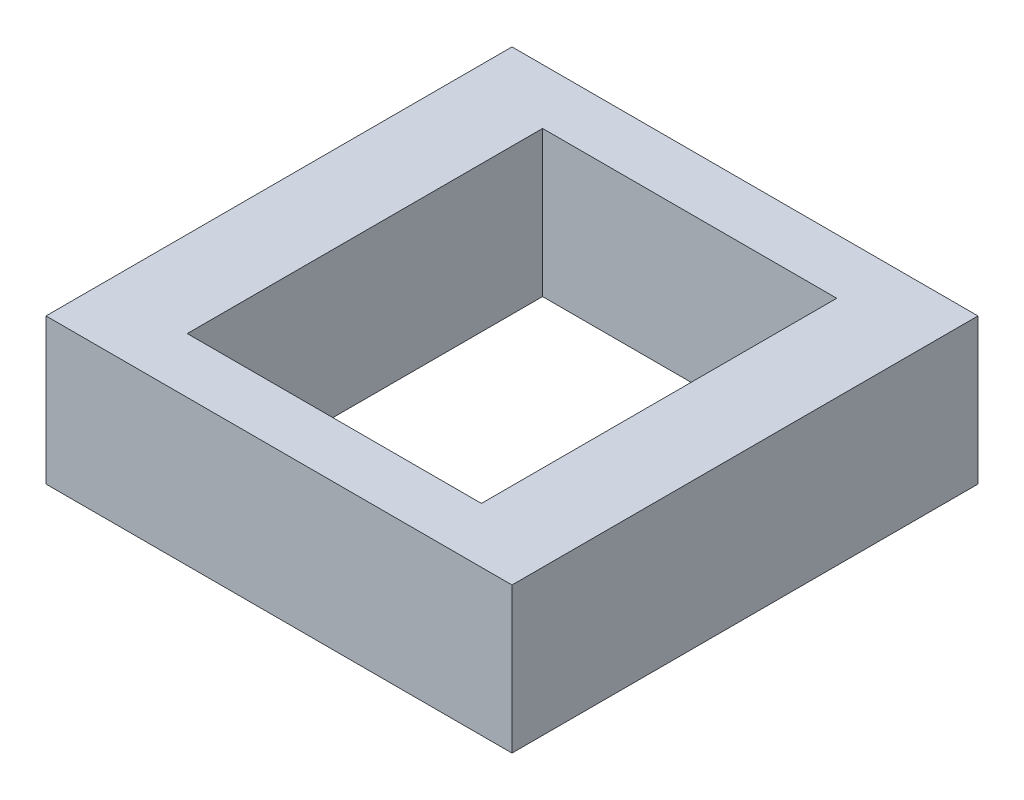
ISO-10303-21;
HEADER;
FILE_DESCRIPTION(('STEP AP214'),'2;1');
FILE_NAME('part.step','',(''),(''),'','','');
FILE_SCHEMA(('AUTOMOTIVE_DESIGN { 1 0 10303 214 1 1 1 1 }'));
ENDSEC;
DATA;
#1=APPLICATION_CONTEXT('core data for automotive mechanical design processes');
#2=APPLICATION_PROTOCOL_DEFINITION('international standard','automotive_design',2000,#1);
#3=PRODUCT_CONTEXT('',#1,'mechanical');
#4=PRODUCT('Part','Part','',(#3));
#5=PRODUCT_RELATED_PRODUCT_CATEGORY('part','',(#4));
#6=PRODUCT_DEFINITION_FORMATION('','',#4);
#7=PRODUCT_DEFINITION_CONTEXT('part definition',#1,'design');
#8=PRODUCT_DEFINITION('design','',#6,#7);
#9=PRODUCT_DEFINITION_SHAPE('','',#8);
#10=(LENGTH_UNIT() NAMED_UNIT(*) SI_UNIT(.MILLI.,.METRE.));
#11=(NAMED_UNIT(*) PLANE_ANGLE_UNIT() SI_UNIT($,.RADIAN.));
#12=(NAMED_UNIT(*) SI_UNIT($,.STERADIAN.) SOLID_ANGLE_UNIT());
#13=UNCERTAINTY_MEASURE_WITH_UNIT(LENGTH_MEASURE(1.E-05),#10,'distance_accuracy_value','');
#14=(GEOMETRIC_REPRESENTATION_CONTEXT(3) GLOBAL_UNCERTAINTY_ASSIGNED_CONTEXT((#13)) GLOBAL_UNIT_ASSIGNED_CONTEXT((#10,
#11,#12)) REPRESENTATION_CONTEXT('',''));
#15=CARTESIAN_POINT('',(0.,0.,0.));
#16=DIRECTION('',(0.,0.,1.));
#17=DIRECTION('',(1.,0.,0.));
#18=AXIS2_PLACEMENT_3D('',#15,#16,#17);
#19=CARTESIAN_POINT('',(0.,5.,0.));
#20=DIRECTION('',(0.,-1.,0.));
#21=DIRECTION('',(0.,0.,-1.));
#22=AXIS2_PLACEMENT_3D('',#19,#20,#21);
#23=PLANE('',#22);
#24=DIRECTION('',(0.,0.,-1.));
#25=VECTOR('',#24,1.);
#26=CARTESIAN_POINT('',(8.,5.,8.));
#27=LINE('',#26,#25);
#28=CARTESIAN_POINT('',(8.,5.,8.));
#29=VERTEX_POINT('',#28);
#30=CARTESIAN_POINT('',(8.,5.,-8.));
#31=VERTEX_POINT('',#30);
#32=EDGE_CURVE('E138',#29,#31,#27,.T.);
#33=ORIENTED_EDGE('',*,*,#32,.T.);
#34=DIRECTION('',(-1.,0.,0.));
#35=VECTOR('',#34,1.);
#36=CARTESIAN_POINT('',(-8.,5.,-8.));
#37=LINE('',#36,#35);
#38=CARTESIAN_POINT('',(-8.,5.,-8.));
#39=VERTEX_POINT('',#38);
#40=EDGE_CURVE('E141',#31,#39,#37,.T.);
#41=ORIENTED_EDGE('',*,*,#40,.T.);
#42=DIRECTION('',(0.,0.,1.));
#43=VECTOR('',#42,1.);
#44=CARTESIAN_POINT('',(-8.,5.,8.));
#45=LINE('',#44,#43);
#46=CARTESIAN_POINT('',(-8.,5.,8.));
#47=VERTEX_POINT('',#46);
#48=EDGE_CURVE('E144',#39,#47,#45,.T.);
#49=ORIENTED_EDGE('',*,*,#48,.T.);
#50=DIRECTION('',(1.,0.,0.));
#51=VECTOR('',#50,1.);
#52=CARTESIAN_POINT('',(-8.,5.,8.));
#53=LINE('',#52,#51);
#54=EDGE_CURVE('E146',#47,#29,#53,.T.);
#55=ORIENTED_EDGE('',*,*,#54,.T.);
#56=EDGE_LOOP('',(#33,#41,#49,#55));
#57=FACE_BOUND('',#56,.T.);
#58=DIRECTION('',(0.,0.,-1.));
#59=VECTOR('',#58,1.);
#60=CARTESIAN_POINT('',(5.05,5.,6.1));
#61=LINE('',#60,#59);
#62=CARTESIAN_POINT('',(5.05,5.,6.1));
#63=VERTEX_POINT('',#62);
#64=CARTESIAN_POINT('',(5.05,5.,-6.1));
#65=VERTEX_POINT('',#64);
#66=EDGE_CURVE('E102',#63,#65,#61,.T.);
#67=ORIENTED_EDGE('',*,*,#66,.F.);
#68=DIRECTION('',(1.,0.,0.));
#69=VECTOR('',#68,1.);
#70=CARTESIAN_POINT('',(-5.05,5.,6.1));
#71=LINE('',#70,#69);
#72=CARTESIAN_POINT('',(-5.05,5.,6.1));
#73=VERTEX_POINT('',#72);
#74=EDGE_CURVE('E124',#73,#63,#71,.T.);
#75=ORIENTED_EDGE('',*,*,#74,.F.);
#76=DIRECTION('',(0.,0.,1.));
#77=VECTOR('',#76,1.);
#78=CARTESIAN_POINT('',(-5.05,5.,6.1));
#79=LINE('',#78,#77);
#80=CARTESIAN_POINT('',(-5.05,5.,-6.1));
#81=VERTEX_POINT('',#80);
#82=EDGE_CURVE('E122',#81,#73,#79,.T.);
#83=ORIENTED_EDGE('',*,*,#82,.F.);
#84=DIRECTION('',(-1.,0.,0.));
#85=VECTOR('',#84,1.);
#86=CARTESIAN_POINT('',(-5.05,5.,-6.1));
#87=LINE('',#86,#85);
#88=EDGE_CURVE('E110',#65,#81,#87,.T.);
#89=ORIENTED_EDGE('',*,*,#88,.F.);
#90=EDGE_LOOP('',(#67,#75,#83,#89));
#91=FACE_BOUND('',#90,.T.);
#92=ADVANCED_FACE('F37',(#57,#91),#23,.F.);
#93=CARTESIAN_POINT('',(0.,0.,0.));
#94=DIRECTION('',(0.,-1.,0.));
#95=DIRECTION('',(0.,0.,-1.));
#96=AXIS2_PLACEMENT_3D('',#93,#94,#95);
#97=PLANE('',#96);
#98=DIRECTION('',(0.,0.,-1.));
#99=VECTOR('',#98,1.);
#100=CARTESIAN_POINT('',(8.,0.,8.));
#101=LINE('',#100,#99);
#102=CARTESIAN_POINT('',(8.,0.,8.));
#103=VERTEX_POINT('',#102);
#104=CARTESIAN_POINT('',(8.,0.,-8.));
#105=VERTEX_POINT('',#104);
#106=EDGE_CURVE('E118',#103,#105,#101,.T.);
#107=ORIENTED_EDGE('',*,*,#106,.F.);
#108=DIRECTION('',(1.,0.,0.));
#109=VECTOR('',#108,1.);
#110=CARTESIAN_POINT('',(-8.,0.,8.));
#111=LINE('',#110,#109);
#112=CARTESIAN_POINT('',(-8.,0.,8.));
#113=VERTEX_POINT('',#112);
#114=EDGE_CURVE('E142',#113,#103,#111,.T.);
#115=ORIENTED_EDGE('',*,*,#114,.F.);
#116=DIRECTION('',(0.,0.,1.));
#117=VECTOR('',#116,1.);
#118=CARTESIAN_POINT('',(-8.,0.,8.));
#119=LINE('',#118,#117);
#120=CARTESIAN_POINT('',(-8.,0.,-8.));
#121=VERTEX_POINT('',#120);
#122=EDGE_CURVE('E153',#121,#113,#119,.T.);
#123=ORIENTED_EDGE('',*,*,#122,.F.);
#124=DIRECTION('',(-1.,0.,0.));
#125=VECTOR('',#124,1.);
#126=CARTESIAN_POINT('',(-8.,0.,-8.));
#127=LINE('',#126,#125);
#128=EDGE_CURVE('E151',#105,#121,#127,.T.);
#129=ORIENTED_EDGE('',*,*,#128,.F.);
#130=EDGE_LOOP('',(#107,#115,#123,#129));
#131=FACE_BOUND('',#130,.T.);
#132=DIRECTION('',(1.,0.,0.));
#133=VECTOR('',#132,1.);
#134=CARTESIAN_POINT('',(-5.05,0.,6.1));
#135=LINE('',#134,#133);
#136=CARTESIAN_POINT('',(-5.05,0.,6.1));
#137=VERTEX_POINT('',#136);
#138=CARTESIAN_POINT('',(5.05,0.,6.1));
#139=VERTEX_POINT('',#138);
#140=EDGE_CURVE('E111',#137,#139,#135,.T.);
#141=ORIENTED_EDGE('',*,*,#140,.T.);
#142=DIRECTION('',(0.,0.,-1.));
#143=VECTOR('',#142,1.);
#144=CARTESIAN_POINT('',(5.05,0.,6.1));
#145=LINE('',#144,#143);
#146=CARTESIAN_POINT('',(5.05,0.,-6.1));
#147=VERTEX_POINT('',#146);
#148=EDGE_CURVE('E60',#139,#147,#145,.T.);
#149=ORIENTED_EDGE('',*,*,#148,.T.);
#150=DIRECTION('',(-1.,0.,0.));
#151=VECTOR('',#150,1.);
#152=CARTESIAN_POINT('',(-5.05,0.,-6.1));
#153=LINE('',#152,#151);
#154=CARTESIAN_POINT('',(-5.05,0.,-6.1));
#155=VERTEX_POINT('',#154);
#156=EDGE_CURVE('E117',#147,#155,#153,.T.);
#157=ORIENTED_EDGE('',*,*,#156,.T.);
#158=DIRECTION('',(0.,0.,1.));
#159=VECTOR('',#158,1.);
#160=CARTESIAN_POINT('',(-5.05,0.,6.1));
#161=LINE('',#160,#159);
#162=EDGE_CURVE('E130',#155,#137,#161,.T.);
#163=ORIENTED_EDGE('',*,*,#162,.T.);
#164=EDGE_LOOP('',(#141,#149,#157,#163));
#165=FACE_BOUND('',#164,.T.);
#166=ADVANCED_FACE('F171',(#131,#165),#97,.T.);
#167=CARTESIAN_POINT('',(8.,5.,8.));
#168=DIRECTION('',(-1.,0.,0.));
#169=DIRECTION('',(0.,0.,1.));
#170=AXIS2_PLACEMENT_3D('',#167,#168,#169);
#171=PLANE('',#170);
#172=ORIENTED_EDGE('',*,*,#106,.T.);
#173=DIRECTION('',(0.,-1.,0.));
#174=VECTOR('',#173,1.);
#175=CARTESIAN_POINT('',(8.,5.,-8.));
#176=LINE('',#175,#174);
#177=EDGE_CURVE('E11',#31,#105,#176,.T.);
#178=ORIENTED_EDGE('',*,*,#177,.F.);
#179=ORIENTED_EDGE('',*,*,#32,.F.);
#180=DIRECTION('',(0.,-1.,0.));
#181=VECTOR('',#180,1.);
#182=CARTESIAN_POINT('',(8.,5.,8.));
#183=LINE('',#182,#181);
#184=EDGE_CURVE('E148',#29,#103,#183,.T.);
#185=ORIENTED_EDGE('',*,*,#184,.T.);
#186=EDGE_LOOP('',(#172,#178,#179,#185));
#187=FACE_BOUND('',#186,.T.);
#188=ADVANCED_FACE('F39',(#187),#171,.F.);
#189=CARTESIAN_POINT('',(-8.,5.,-8.));
#190=DIRECTION('',(0.,0.,1.));
#191=DIRECTION('',(1.,0.,0.));
#192=AXIS2_PLACEMENT_3D('',#189,#190,#191);
#193=PLANE('',#192);
#194=ORIENTED_EDGE('',*,*,#128,.T.);
#195=DIRECTION('',(0.,-1.,0.));
#196=VECTOR('',#195,1.);
#197=CARTESIAN_POINT('',(-8.,5.,-8.));
#198=LINE('',#197,#196);
#199=EDGE_CURVE('E45',#39,#121,#198,.T.);
#200=ORIENTED_EDGE('',*,*,#199,.F.);
#201=ORIENTED_EDGE('',*,*,#40,.F.);
#202=ORIENTED_EDGE('',*,*,#177,.T.);
#203=EDGE_LOOP('',(#194,#200,#201,#202));
#204=FACE_BOUND('',#203,.T.);
#205=ADVANCED_FACE('F181',(#204),#193,.F.);
#206=CARTESIAN_POINT('',(-8.,5.,8.));
#207=DIRECTION('',(1.,0.,0.));
#208=DIRECTION('',(0.,0.,-1.));
#209=AXIS2_PLACEMENT_3D('',#206,#207,#208);
#210=PLANE('',#209);
#211=ORIENTED_EDGE('',*,*,#122,.T.);
#212=DIRECTION('',(0.,-1.,0.));
#213=VECTOR('',#212,1.);
#214=CARTESIAN_POINT('',(-8.,5.,8.));
#215=LINE('',#214,#213);
#216=EDGE_CURVE('E158',#47,#113,#215,.T.);
#217=ORIENTED_EDGE('',*,*,#216,.F.);
#218=ORIENTED_EDGE('',*,*,#48,.F.);
#219=ORIENTED_EDGE('',*,*,#199,.T.);
#220=EDGE_LOOP('',(#211,#217,#218,#219));
#221=FACE_BOUND('',#220,.T.);
#222=ADVANCED_FACE('F165',(#221),#210,.F.);
#223=CARTESIAN_POINT('',(-8.,5.,8.));
#224=DIRECTION('',(0.,0.,-1.));
#225=DIRECTION('',(-1.,0.,0.));
#226=AXIS2_PLACEMENT_3D('',#223,#224,#225);
#227=PLANE('',#226);
#228=ORIENTED_EDGE('',*,*,#114,.T.);
#229=ORIENTED_EDGE('',*,*,#184,.F.);
#230=ORIENTED_EDGE('',*,*,#54,.F.);
#231=ORIENTED_EDGE('',*,*,#216,.T.);
#232=EDGE_LOOP('',(#228,#229,#230,#231));
#233=FACE_BOUND('',#232,.T.);
#234=ADVANCED_FACE('F175',(#233),#227,.F.);
#235=CARTESIAN_POINT('',(5.05,5.,6.1));
#236=DIRECTION('',(-1.,0.,0.));
#237=DIRECTION('',(0.,0.,1.));
#238=AXIS2_PLACEMENT_3D('',#235,#236,#237);
#239=PLANE('',#238);
#240=ORIENTED_EDGE('',*,*,#148,.F.);
#241=DIRECTION('',(0.,-1.,0.));
#242=VECTOR('',#241,1.);
#243=CARTESIAN_POINT('',(5.05,5.,6.1));
#244=LINE('',#243,#242);
#245=EDGE_CURVE('E106',#63,#139,#244,.T.);
#246=ORIENTED_EDGE('',*,*,#245,.F.);
#247=ORIENTED_EDGE('',*,*,#66,.T.);
#248=DIRECTION('',(0.,-1.,0.));
#249=VECTOR('',#248,1.);
#250=CARTESIAN_POINT('',(5.05,5.,-6.1));
#251=LINE('',#250,#249);
#252=EDGE_CURVE('E105',#65,#147,#251,.T.);
#253=ORIENTED_EDGE('',*,*,#252,.T.);
#254=EDGE_LOOP('',(#240,#246,#247,#253));
#255=FACE_BOUND('',#254,.T.);
#256=ADVANCED_FACE('F104',(#255),#239,.T.);
#257=CARTESIAN_POINT('',(-5.05,5.,-6.1));
#258=DIRECTION('',(0.,0.,1.));
#259=DIRECTION('',(1.,0.,0.));
#260=AXIS2_PLACEMENT_3D('',#257,#258,#259);
#261=PLANE('',#260);
#262=ORIENTED_EDGE('',*,*,#156,.F.);
#263=ORIENTED_EDGE('',*,*,#252,.F.);
#264=ORIENTED_EDGE('',*,*,#88,.T.);
#265=DIRECTION('',(0.,-1.,0.));
#266=VECTOR('',#265,1.);
#267=CARTESIAN_POINT('',(-5.05,5.,-6.1));
#268=LINE('',#267,#266);
#269=EDGE_CURVE('E119',#81,#155,#268,.T.);
#270=ORIENTED_EDGE('',*,*,#269,.T.);
#271=EDGE_LOOP('',(#262,#263,#264,#270));
#272=FACE_BOUND('',#271,.T.);
#273=ADVANCED_FACE('F114',(#272),#261,.T.);
#274=CARTESIAN_POINT('',(-5.05,5.,6.1));
#275=DIRECTION('',(1.,0.,0.));
#276=DIRECTION('',(0.,0.,-1.));
#277=AXIS2_PLACEMENT_3D('',#274,#275,#276);
#278=PLANE('',#277);
#279=ORIENTED_EDGE('',*,*,#162,.F.);
#280=ORIENTED_EDGE('',*,*,#269,.F.);
#281=ORIENTED_EDGE('',*,*,#82,.T.);
#282=DIRECTION('',(0.,-1.,0.));
#283=VECTOR('',#282,1.);
#284=CARTESIAN_POINT('',(-5.05,5.,6.1));
#285=LINE('',#284,#283);
#286=EDGE_CURVE('E52',#73,#137,#285,.T.);
#287=ORIENTED_EDGE('',*,*,#286,.T.);
#288=EDGE_LOOP('',(#279,#280,#281,#287));
#289=FACE_BOUND('',#288,.T.);
#290=ADVANCED_FACE('F204',(#289),#278,.T.);
#291=CARTESIAN_POINT('',(-5.05,5.,6.1));
#292=DIRECTION('',(0.,0.,-1.));
#293=DIRECTION('',(-1.,0.,0.));
#294=AXIS2_PLACEMENT_3D('',#291,#292,#293);
#295=PLANE('',#294);
#296=ORIENTED_EDGE('',*,*,#140,.F.);
#297=ORIENTED_EDGE('',*,*,#286,.F.);
#298=ORIENTED_EDGE('',*,*,#74,.T.);
#299=ORIENTED_EDGE('',*,*,#245,.T.);
#300=EDGE_LOOP('',(#296,#297,#298,#299));
#301=FACE_BOUND('',#300,.T.);
#302=ADVANCED_FACE('F208',(#301),#295,.T.);
#303=CLOSED_SHELL('',(#92,#166,#188,#205,#222,#234,#256,#273,#290,#302));
#304=MANIFOLD_SOLID_BREP('B2',#303);
#305=ADVANCED_BREP_SHAPE_REPRESENTATION('',(#18,#304),#14);
#306=SHAPE_DEFINITION_REPRESENTATION(#9,#305);
ENDSEC;
END-ISO-10303-21;
